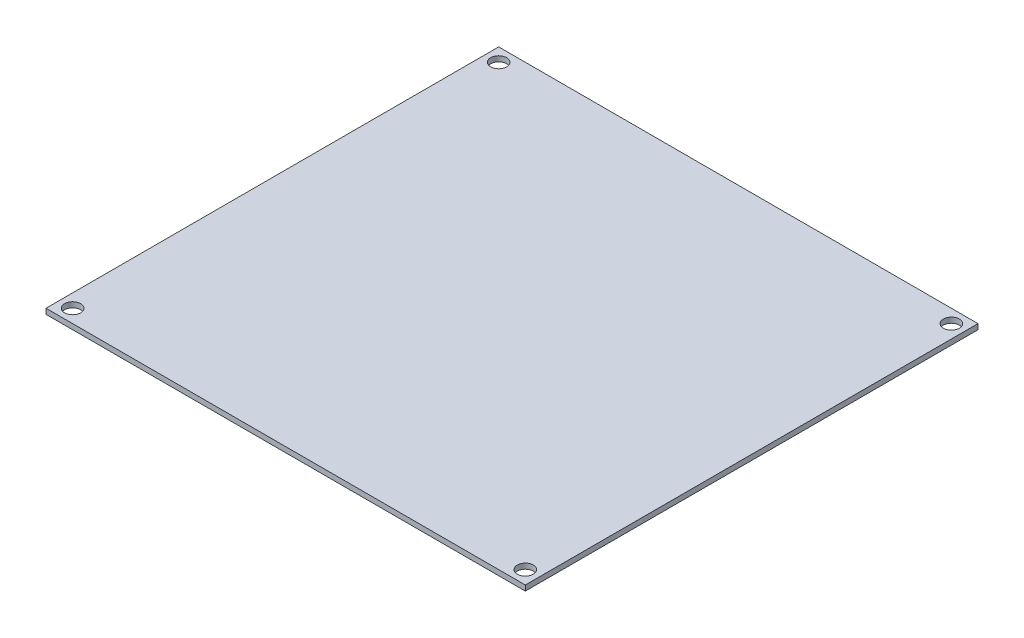
ISO-10303-21;
HEADER;
FILE_DESCRIPTION(('STEP AP214'),'2;1');
FILE_NAME('part.step','',(''),(''),'','','');
FILE_SCHEMA(('AUTOMOTIVE_DESIGN { 1 0 10303 214 1 1 1 1 }'));
ENDSEC;
DATA;
#1=APPLICATION_CONTEXT('core data for automotive mechanical design processes');
#2=APPLICATION_PROTOCOL_DEFINITION('international standard','automotive_design',2000,#1);
#3=PRODUCT_CONTEXT('',#1,'mechanical');
#4=PRODUCT('Part','Part','',(#3));
#5=PRODUCT_RELATED_PRODUCT_CATEGORY('part','',(#4));
#6=PRODUCT_DEFINITION_FORMATION('','',#4);
#7=PRODUCT_DEFINITION_CONTEXT('part definition',#1,'design');
#8=PRODUCT_DEFINITION('design','',#6,#7);
#9=PRODUCT_DEFINITION_SHAPE('','',#8);
#10=(LENGTH_UNIT() NAMED_UNIT(*) SI_UNIT(.MILLI.,.METRE.));
#11=(NAMED_UNIT(*) PLANE_ANGLE_UNIT() SI_UNIT($,.RADIAN.));
#12=(NAMED_UNIT(*) SI_UNIT($,.STERADIAN.) SOLID_ANGLE_UNIT());
#13=UNCERTAINTY_MEASURE_WITH_UNIT(LENGTH_MEASURE(1.E-05),#10,'distance_accuracy_value','');
#14=(GEOMETRIC_REPRESENTATION_CONTEXT(3) GLOBAL_UNCERTAINTY_ASSIGNED_CONTEXT((#13)) GLOBAL_UNIT_ASSIGNED_CONTEXT((#10,
#11,#12)) REPRESENTATION_CONTEXT('',''));
#15=CARTESIAN_POINT('',(0.,0.,0.));
#16=DIRECTION('',(0.,0.,1.));
#17=DIRECTION('',(1.,0.,0.));
#18=AXIS2_PLACEMENT_3D('',#15,#16,#17);
#19=CARTESIAN_POINT('',(0.,2.,0.));
#20=DIRECTION('',(0.,-1.,0.));
#21=DIRECTION('',(0.,0.,-1.));
#22=AXIS2_PLACEMENT_3D('',#19,#20,#21);
#23=PLANE('',#22);
#24=DIRECTION('',(1.,0.,0.));
#25=VECTOR('',#24,1.);
#26=CARTESIAN_POINT('',(-90.,2.,85.));
#27=LINE('',#26,#25);
#28=CARTESIAN_POINT('',(-90.,2.,85.));
#29=VERTEX_POINT('',#28);
#30=CARTESIAN_POINT('',(90.,2.,85.));
#31=VERTEX_POINT('',#30);
#32=EDGE_CURVE('E87',#29,#31,#27,.T.);
#33=ORIENTED_EDGE('',*,*,#32,.T.);
#34=DIRECTION('',(0.,0.,-1.));
#35=VECTOR('',#34,1.);
#36=CARTESIAN_POINT('',(90.,2.,-85.));
#37=LINE('',#36,#35);
#38=CARTESIAN_POINT('',(90.,2.,-85.));
#39=VERTEX_POINT('',#38);
#40=EDGE_CURVE('E82',#31,#39,#37,.T.);
#41=ORIENTED_EDGE('',*,*,#40,.T.);
#42=DIRECTION('',(-1.,0.,0.));
#43=VECTOR('',#42,1.);
#44=CARTESIAN_POINT('',(-90.,2.,-85.));
#45=LINE('',#44,#43);
#46=CARTESIAN_POINT('',(-90.,2.,-85.));
#47=VERTEX_POINT('',#46);
#48=EDGE_CURVE('E85',#39,#47,#45,.T.);
#49=ORIENTED_EDGE('',*,*,#48,.T.);
#50=DIRECTION('',(0.,0.,1.));
#51=VECTOR('',#50,1.);
#52=CARTESIAN_POINT('',(-90.,2.,-85.));
#53=LINE('',#52,#51);
#54=EDGE_CURVE('E52',#47,#29,#53,.T.);
#55=ORIENTED_EDGE('',*,*,#54,.T.);
#56=EDGE_LOOP('',(#33,#41,#49,#55));
#57=FACE_BOUND('',#56,.T.);
#58=CARTESIAN_POINT('',(85.,2.,80.));
#59=DIRECTION('',(0.,1.,0.));
#60=DIRECTION('',(0.,0.,-1.));
#61=AXIS2_PLACEMENT_3D('',#58,#59,#60);
#62=CIRCLE('',#61,2.99999999999999);
#63=CARTESIAN_POINT('',(85.,2.,77.));
#64=VERTEX_POINT('',#63);
#65=EDGE_CURVE('E102',#64,#64,#62,.T.);
#66=ORIENTED_EDGE('',*,*,#65,.F.);
#67=EDGE_LOOP('',(#66));
#68=FACE_BOUND('',#67,.T.);
#69=CARTESIAN_POINT('',(-85.,2.,-80.));
#70=DIRECTION('',(0.,1.,0.));
#71=DIRECTION('',(0.,0.,1.));
#72=AXIS2_PLACEMENT_3D('',#69,#70,#71);
#73=CIRCLE('',#72,3.00000000000002);
#74=CARTESIAN_POINT('',(-85.,2.,-77.));
#75=VERTEX_POINT('',#74);
#76=EDGE_CURVE('E117',#75,#75,#73,.T.);
#77=ORIENTED_EDGE('',*,*,#76,.F.);
#78=EDGE_LOOP('',(#77));
#79=FACE_BOUND('',#78,.T.);
#80=CARTESIAN_POINT('',(-85.,2.,80.));
#81=DIRECTION('',(0.,1.,0.));
#82=DIRECTION('',(0.,0.,1.));
#83=AXIS2_PLACEMENT_3D('',#80,#81,#82);
#84=CIRCLE('',#83,3.00000000000002);
#85=CARTESIAN_POINT('',(-85.,2.,83.));
#86=VERTEX_POINT('',#85);
#87=EDGE_CURVE('E123',#86,#86,#84,.T.);
#88=ORIENTED_EDGE('',*,*,#87,.F.);
#89=EDGE_LOOP('',(#88));
#90=FACE_BOUND('',#89,.T.);
#91=CARTESIAN_POINT('',(85.,2.,-80.));
#92=DIRECTION('',(0.,1.,0.));
#93=DIRECTION('',(0.,0.,-1.));
#94=AXIS2_PLACEMENT_3D('',#91,#92,#93);
#95=CIRCLE('',#94,3.00000000000002);
#96=CARTESIAN_POINT('',(85.,2.,-83.));
#97=VERTEX_POINT('',#96);
#98=EDGE_CURVE('E129',#97,#97,#95,.T.);
#99=ORIENTED_EDGE('',*,*,#98,.F.);
#100=EDGE_LOOP('',(#99));
#101=FACE_BOUND('',#100,.T.);
#102=ADVANCED_FACE('F35',(#57,#68,#79,#90,#101),#23,.F.);
#103=CARTESIAN_POINT('',(0.,0.,0.));
#104=DIRECTION('',(0.,-1.,0.));
#105=DIRECTION('',(0.,0.,-1.));
#106=AXIS2_PLACEMENT_3D('',#103,#104,#105);
#107=PLANE('',#106);
#108=CARTESIAN_POINT('',(-85.,0.,80.));
#109=DIRECTION('',(0.,1.,0.));
#110=DIRECTION('',(0.,0.,1.));
#111=AXIS2_PLACEMENT_3D('',#108,#109,#110);
#112=CIRCLE('',#111,3.00000000000002);
#113=CARTESIAN_POINT('',(-85.,0.,83.));
#114=VERTEX_POINT('',#113);
#115=EDGE_CURVE('E126',#114,#114,#112,.T.);
#116=ORIENTED_EDGE('',*,*,#115,.T.);
#117=EDGE_LOOP('',(#116));
#118=FACE_BOUND('',#117,.T.);
#119=CARTESIAN_POINT('',(85.,0.,80.));
#120=DIRECTION('',(0.,1.,0.));
#121=DIRECTION('',(0.,0.,-1.));
#122=AXIS2_PLACEMENT_3D('',#119,#120,#121);
#123=CIRCLE('',#122,2.99999999999999);
#124=CARTESIAN_POINT('',(85.,0.,77.));
#125=VERTEX_POINT('',#124);
#126=EDGE_CURVE('E114',#125,#125,#123,.T.);
#127=ORIENTED_EDGE('',*,*,#126,.T.);
#128=EDGE_LOOP('',(#127));
#129=FACE_BOUND('',#128,.T.);
#130=DIRECTION('',(1.,0.,0.));
#131=VECTOR('',#130,1.);
#132=CARTESIAN_POINT('',(-90.,0.,85.));
#133=LINE('',#132,#131);
#134=CARTESIAN_POINT('',(-90.,0.,85.));
#135=VERTEX_POINT('',#134);
#136=CARTESIAN_POINT('',(90.,0.,85.));
#137=VERTEX_POINT('',#136);
#138=EDGE_CURVE('E99',#135,#137,#133,.T.);
#139=ORIENTED_EDGE('',*,*,#138,.F.);
#140=DIRECTION('',(0.,0.,1.));
#141=VECTOR('',#140,1.);
#142=CARTESIAN_POINT('',(-90.,0.,-85.));
#143=LINE('',#142,#141);
#144=CARTESIAN_POINT('',(-90.,0.,-85.));
#145=VERTEX_POINT('',#144);
#146=EDGE_CURVE('E75',#145,#135,#143,.T.);
#147=ORIENTED_EDGE('',*,*,#146,.F.);
#148=DIRECTION('',(-1.,0.,0.));
#149=VECTOR('',#148,1.);
#150=CARTESIAN_POINT('',(-90.,0.,-85.));
#151=LINE('',#150,#149);
#152=CARTESIAN_POINT('',(90.,0.,-85.));
#153=VERTEX_POINT('',#152);
#154=EDGE_CURVE('E69',#153,#145,#151,.T.);
#155=ORIENTED_EDGE('',*,*,#154,.F.);
#156=DIRECTION('',(0.,0.,-1.));
#157=VECTOR('',#156,1.);
#158=CARTESIAN_POINT('',(90.,0.,-85.));
#159=LINE('',#158,#157);
#160=EDGE_CURVE('E91',#137,#153,#159,.T.);
#161=ORIENTED_EDGE('',*,*,#160,.F.);
#162=EDGE_LOOP('',(#139,#147,#155,#161));
#163=FACE_BOUND('',#162,.T.);
#164=CARTESIAN_POINT('',(-85.,0.,-80.));
#165=DIRECTION('',(0.,1.,0.));
#166=DIRECTION('',(0.,0.,1.));
#167=AXIS2_PLACEMENT_3D('',#164,#165,#166);
#168=CIRCLE('',#167,3.00000000000002);
#169=CARTESIAN_POINT('',(-85.,0.,-77.));
#170=VERTEX_POINT('',#169);
#171=EDGE_CURVE('E120',#170,#170,#168,.T.);
#172=ORIENTED_EDGE('',*,*,#171,.T.);
#173=EDGE_LOOP('',(#172));
#174=FACE_BOUND('',#173,.T.);
#175=CARTESIAN_POINT('',(85.,0.,-80.));
#176=DIRECTION('',(0.,1.,0.));
#177=DIRECTION('',(0.,0.,-1.));
#178=AXIS2_PLACEMENT_3D('',#175,#176,#177);
#179=CIRCLE('',#178,3.00000000000002);
#180=CARTESIAN_POINT('',(85.,0.,-83.));
#181=VERTEX_POINT('',#180);
#182=EDGE_CURVE('E132',#181,#181,#179,.T.);
#183=ORIENTED_EDGE('',*,*,#182,.T.);
#184=EDGE_LOOP('',(#183));
#185=FACE_BOUND('',#184,.T.);
#186=ADVANCED_FACE('F110',(#118,#129,#163,#174,#185),#107,.T.);
#187=CARTESIAN_POINT('',(-90.,2.,85.));
#188=DIRECTION('',(0.,0.,-1.));
#189=DIRECTION('',(-1.,0.,0.));
#190=AXIS2_PLACEMENT_3D('',#187,#188,#189);
#191=PLANE('',#190);
#192=ORIENTED_EDGE('',*,*,#138,.T.);
#193=DIRECTION('',(0.,-1.,0.));
#194=VECTOR('',#193,1.);
#195=CARTESIAN_POINT('',(90.,2.,85.));
#196=LINE('',#195,#194);
#197=EDGE_CURVE('E11',#31,#137,#196,.T.);
#198=ORIENTED_EDGE('',*,*,#197,.F.);
#199=ORIENTED_EDGE('',*,*,#32,.F.);
#200=DIRECTION('',(0.,-1.,0.));
#201=VECTOR('',#200,1.);
#202=CARTESIAN_POINT('',(-90.,2.,85.));
#203=LINE('',#202,#201);
#204=EDGE_CURVE('E95',#29,#135,#203,.T.);
#205=ORIENTED_EDGE('',*,*,#204,.T.);
#206=EDGE_LOOP('',(#192,#198,#199,#205));
#207=FACE_BOUND('',#206,.T.);
#208=ADVANCED_FACE('F37',(#207),#191,.F.);
#209=CARTESIAN_POINT('',(90.,2.,-85.));
#210=DIRECTION('',(-1.,0.,0.));
#211=DIRECTION('',(0.,0.,1.));
#212=AXIS2_PLACEMENT_3D('',#209,#210,#211);
#213=PLANE('',#212);
#214=ORIENTED_EDGE('',*,*,#160,.T.);
#215=DIRECTION('',(0.,-1.,0.));
#216=VECTOR('',#215,1.);
#217=CARTESIAN_POINT('',(90.,2.,-85.));
#218=LINE('',#217,#216);
#219=EDGE_CURVE('E44',#39,#153,#218,.T.);
#220=ORIENTED_EDGE('',*,*,#219,.F.);
#221=ORIENTED_EDGE('',*,*,#40,.F.);
#222=ORIENTED_EDGE('',*,*,#197,.T.);
#223=EDGE_LOOP('',(#214,#220,#221,#222));
#224=FACE_BOUND('',#223,.T.);
#225=ADVANCED_FACE('F90',(#224),#213,.F.);
#226=CARTESIAN_POINT('',(-90.,2.,-85.));
#227=DIRECTION('',(0.,0.,1.));
#228=DIRECTION('',(1.,0.,0.));
#229=AXIS2_PLACEMENT_3D('',#226,#227,#228);
#230=PLANE('',#229);
#231=ORIENTED_EDGE('',*,*,#154,.T.);
#232=DIRECTION('',(0.,-1.,0.));
#233=VECTOR('',#232,1.);
#234=CARTESIAN_POINT('',(-90.,2.,-85.));
#235=LINE('',#234,#233);
#236=EDGE_CURVE('E92',#47,#145,#235,.T.);
#237=ORIENTED_EDGE('',*,*,#236,.F.);
#238=ORIENTED_EDGE('',*,*,#48,.F.);
#239=ORIENTED_EDGE('',*,*,#219,.T.);
#240=EDGE_LOOP('',(#231,#237,#238,#239));
#241=FACE_BOUND('',#240,.T.);
#242=ADVANCED_FACE('F93',(#241),#230,.F.);
#243=CARTESIAN_POINT('',(-90.,2.,-85.));
#244=DIRECTION('',(1.,0.,0.));
#245=DIRECTION('',(0.,0.,-1.));
#246=AXIS2_PLACEMENT_3D('',#243,#244,#245);
#247=PLANE('',#246);
#248=ORIENTED_EDGE('',*,*,#146,.T.);
#249=ORIENTED_EDGE('',*,*,#204,.F.);
#250=ORIENTED_EDGE('',*,*,#54,.F.);
#251=ORIENTED_EDGE('',*,*,#236,.T.);
#252=EDGE_LOOP('',(#248,#249,#250,#251));
#253=FACE_BOUND('',#252,.T.);
#254=ADVANCED_FACE('F107',(#253),#247,.F.);
#255=CARTESIAN_POINT('',(85.,2.,80.));
#256=DIRECTION('',(0.,-1.,0.));
#257=DIRECTION('',(0.,0.,-1.));
#258=AXIS2_PLACEMENT_3D('',#255,#256,#257);
#259=CYLINDRICAL_SURFACE('',#258,2.99999999999999);
#260=ORIENTED_EDGE('',*,*,#65,.T.);
#261=EDGE_LOOP('',(#260));
#262=FACE_BOUND('',#261,.T.);
#263=ORIENTED_EDGE('',*,*,#126,.F.);
#264=EDGE_LOOP('',(#263));
#265=FACE_BOUND('',#264,.T.);
#266=ADVANCED_FACE('F149',(#262,#265),#259,.F.);
#267=CARTESIAN_POINT('',(-85.,2.,-80.));
#268=DIRECTION('',(0.,-1.,0.));
#269=DIRECTION('',(0.,0.,-1.));
#270=AXIS2_PLACEMENT_3D('',#267,#268,#269);
#271=CYLINDRICAL_SURFACE('',#270,3.00000000000002);
#272=ORIENTED_EDGE('',*,*,#76,.T.);
#273=EDGE_LOOP('',(#272));
#274=FACE_BOUND('',#273,.T.);
#275=ORIENTED_EDGE('',*,*,#171,.F.);
#276=EDGE_LOOP('',(#275));
#277=FACE_BOUND('',#276,.T.);
#278=ADVANCED_FACE('F195',(#274,#277),#271,.F.);
#279=CARTESIAN_POINT('',(-85.,2.,80.));
#280=DIRECTION('',(0.,-1.,0.));
#281=DIRECTION('',(0.,0.,-1.));
#282=AXIS2_PLACEMENT_3D('',#279,#280,#281);
#283=CYLINDRICAL_SURFACE('',#282,3.00000000000002);
#284=ORIENTED_EDGE('',*,*,#87,.T.);
#285=EDGE_LOOP('',(#284));
#286=FACE_BOUND('',#285,.T.);
#287=ORIENTED_EDGE('',*,*,#115,.F.);
#288=EDGE_LOOP('',(#287));
#289=FACE_BOUND('',#288,.T.);
#290=ADVANCED_FACE('F203',(#286,#289),#283,.F.);
#291=CARTESIAN_POINT('',(85.,2.,-80.));
#292=DIRECTION('',(0.,-1.,0.));
#293=DIRECTION('',(0.,0.,-1.));
#294=AXIS2_PLACEMENT_3D('',#291,#292,#293);
#295=CYLINDRICAL_SURFACE('',#294,3.00000000000002);
#296=ORIENTED_EDGE('',*,*,#98,.T.);
#297=EDGE_LOOP('',(#296));
#298=FACE_BOUND('',#297,.T.);
#299=ORIENTED_EDGE('',*,*,#182,.F.);
#300=EDGE_LOOP('',(#299));
#301=FACE_BOUND('',#300,.T.);
#302=ADVANCED_FACE('F138',(#298,#301),#295,.F.);
#303=CLOSED_SHELL('',(#102,#186,#208,#225,#242,#254,#266,#278,#290,#302));
#304=MANIFOLD_SOLID_BREP('B2',#303);
#305=ADVANCED_BREP_SHAPE_REPRESENTATION('',(#18,#304),#14);
#306=SHAPE_DEFINITION_REPRESENTATION(#9,#305);
ENDSEC;
END-ISO-10303-21;
